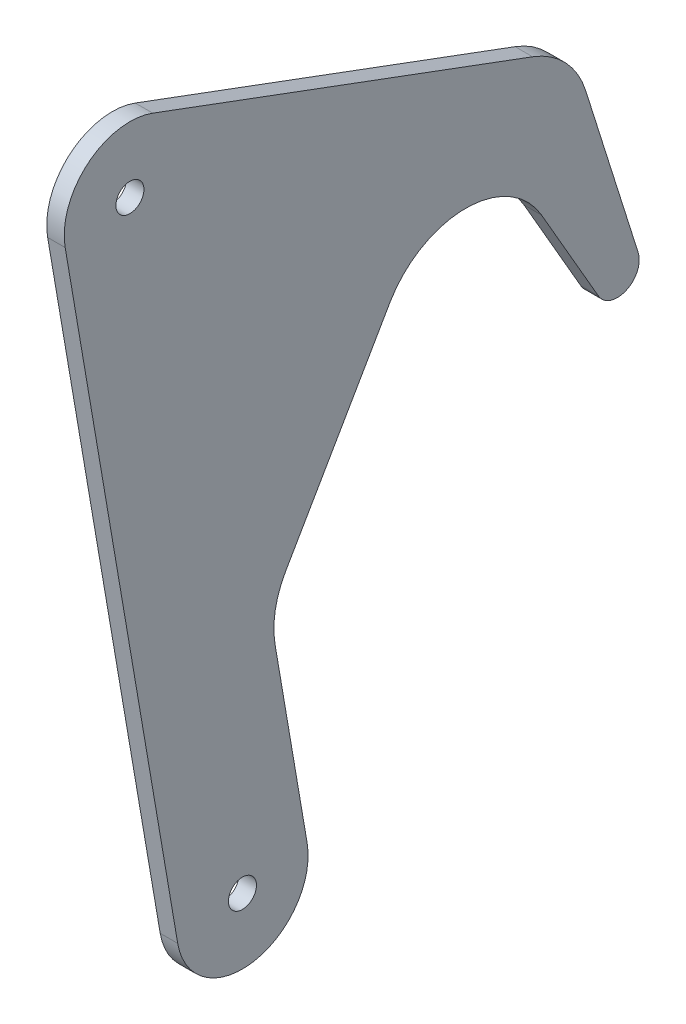
ISO-10303-21;
HEADER;
FILE_DESCRIPTION(('STEP AP214'),'2;1');
FILE_NAME('part.step','',(''),(''),'','','');
FILE_SCHEMA(('AUTOMOTIVE_DESIGN { 1 0 10303 214 1 1 1 1 }'));
ENDSEC;
DATA;
#1=APPLICATION_CONTEXT('core data for automotive mechanical design processes');
#2=APPLICATION_PROTOCOL_DEFINITION('international standard','automotive_design',2000,#1);
#3=PRODUCT_CONTEXT('',#1,'mechanical');
#4=PRODUCT('Part','Part','',(#3));
#5=PRODUCT_RELATED_PRODUCT_CATEGORY('part','',(#4));
#6=PRODUCT_DEFINITION_FORMATION('','',#4);
#7=PRODUCT_DEFINITION_CONTEXT('part definition',#1,'design');
#8=PRODUCT_DEFINITION('design','',#6,#7);
#9=PRODUCT_DEFINITION_SHAPE('','',#8);
#10=(LENGTH_UNIT() NAMED_UNIT(*) SI_UNIT(.MILLI.,.METRE.));
#11=(NAMED_UNIT(*) PLANE_ANGLE_UNIT() SI_UNIT($,.RADIAN.));
#12=(NAMED_UNIT(*) SI_UNIT($,.STERADIAN.) SOLID_ANGLE_UNIT());
#13=UNCERTAINTY_MEASURE_WITH_UNIT(LENGTH_MEASURE(1.E-05),#10,'distance_accuracy_value','');
#14=(GEOMETRIC_REPRESENTATION_CONTEXT(3) GLOBAL_UNCERTAINTY_ASSIGNED_CONTEXT((#13)) GLOBAL_UNIT_ASSIGNED_CONTEXT((#10,
#11,#12)) REPRESENTATION_CONTEXT('',''));
#15=CARTESIAN_POINT('',(0.,0.,0.));
#16=DIRECTION('',(0.,0.,1.));
#17=DIRECTION('',(1.,0.,0.));
#18=AXIS2_PLACEMENT_3D('',#15,#16,#17);
#19=CARTESIAN_POINT('',(2.54,95.5648840903117,16.3222272442672));
#20=DIRECTION('',(-1.,0.,0.));
#21=DIRECTION('',(0.,0.,1.));
#22=AXIS2_PLACEMENT_3D('',#19,#20,#21);
#23=CYLINDRICAL_SURFACE('',#22,9.52500000000001);
#24=CARTESIAN_POINT('',(0.,95.5648840903117,16.3222272442672));
#25=DIRECTION('',(1.,0.,0.));
#26=DIRECTION('',(0.,0.,-1.));
#27=AXIS2_PLACEMENT_3D('',#24,#25,#26);
#28=CIRCLE('',#27,9.52500000000001);
#29=CARTESIAN_POINT('',(0.,104.493706377936,13.0053375029534));
#30=VERTEX_POINT('',#29);
#31=CARTESIAN_POINT('',(0.,93.961261582819,25.7112644608014));
#32=VERTEX_POINT('',#31);
#33=EDGE_CURVE('E160',#30,#32,#28,.T.);
#34=ORIENTED_EDGE('',*,*,#33,.T.);
#35=DIRECTION('',(-1.,0.,0.));
#36=VECTOR('',#35,1.);
#37=CARTESIAN_POINT('',(2.54,93.961261582819,25.7112644608014));
#38=LINE('',#37,#36);
#39=CARTESIAN_POINT('',(2.54,93.961261582819,25.7112644608014));
#40=VERTEX_POINT('',#39);
#41=EDGE_CURVE('E139',#40,#32,#38,.T.);
#42=ORIENTED_EDGE('',*,*,#41,.F.);
#43=CARTESIAN_POINT('',(2.54,95.5648840903117,16.3222272442672));
#44=DIRECTION('',(1.,0.,0.));
#45=DIRECTION('',(0.,0.,-1.));
#46=AXIS2_PLACEMENT_3D('',#43,#44,#45);
#47=CIRCLE('',#46,9.52500000000001);
#48=CARTESIAN_POINT('',(2.54,104.493706377936,13.0053375029534));
#49=VERTEX_POINT('',#48);
#50=EDGE_CURVE('E147',#49,#40,#47,.T.);
#51=ORIENTED_EDGE('',*,*,#50,.F.);
#52=DIRECTION('',(-1.,0.,0.));
#53=VECTOR('',#52,1.);
#54=CARTESIAN_POINT('',(2.54,104.493706377936,13.0053375029534));
#55=LINE('',#54,#53);
#56=EDGE_CURVE('E189',#49,#30,#55,.T.);
#57=ORIENTED_EDGE('',*,*,#56,.T.);
#58=EDGE_LOOP('',(#34,#42,#51,#57));
#59=FACE_BOUND('',#58,.T.);
#60=ADVANCED_FACE('F44',(#59),#23,.T.);
#61=CARTESIAN_POINT('',(2.54,93.961261582819,25.7112644608014));
#62=DIRECTION('',(0.,0.168359318371934,-0.98572569202458));
#63=DIRECTION('',(0.,0.98572569202458,0.168359318371934));
#64=AXIS2_PLACEMENT_3D('',#61,#62,#63);
#65=PLANE('',#64);
#66=DIRECTION('',(0.,-0.98572569202458,-0.168359318371934));
#67=VECTOR('',#66,1.);
#68=CARTESIAN_POINT('',(0.,93.961261582819,25.7112644608014));
#69=LINE('',#68,#67);
#70=CARTESIAN_POINT('',(0.,-1.60362250749268,9.38903721653413));
#71=VERTEX_POINT('',#70);
#72=EDGE_CURVE('E208',#32,#71,#69,.T.);
#73=ORIENTED_EDGE('',*,*,#72,.T.);
#74=DIRECTION('',(-1.,0.,0.));
#75=VECTOR('',#74,1.);
#76=CARTESIAN_POINT('',(2.54,-1.60362250749268,9.38903721653413));
#77=LINE('',#76,#75);
#78=CARTESIAN_POINT('',(2.54,-1.60362250749268,9.38903721653413));
#79=VERTEX_POINT('',#78);
#80=EDGE_CURVE('E142',#79,#71,#77,.T.);
#81=ORIENTED_EDGE('',*,*,#80,.F.);
#82=DIRECTION('',(0.,-0.98572569202458,-0.168359318371934));
#83=VECTOR('',#82,1.);
#84=CARTESIAN_POINT('',(2.54,93.961261582819,25.7112644608014));
#85=LINE('',#84,#83);
#86=EDGE_CURVE('E135',#40,#79,#85,.T.);
#87=ORIENTED_EDGE('',*,*,#86,.F.);
#88=ORIENTED_EDGE('',*,*,#41,.T.);
#89=EDGE_LOOP('',(#73,#81,#87,#88));
#90=FACE_BOUND('',#89,.T.);
#91=ADVANCED_FACE('F137',(#90),#65,.F.);
#92=CARTESIAN_POINT('',(2.54,0.,0.));
#93=DIRECTION('',(-1.,0.,0.));
#94=DIRECTION('',(0.,0.,1.));
#95=AXIS2_PLACEMENT_3D('',#92,#93,#94);
#96=CYLINDRICAL_SURFACE('',#95,9.525);
#97=CARTESIAN_POINT('',(0.,0.,0.));
#98=DIRECTION('',(1.,0.,0.));
#99=DIRECTION('',(0.,0.,-1.));
#100=AXIS2_PLACEMENT_3D('',#97,#98,#99);
#101=CIRCLE('',#100,9.525);
#102=CARTESIAN_POINT('',(0.,1.60362250749268,-9.38903721653413));
#103=VERTEX_POINT('',#102);
#104=EDGE_CURVE('E206',#71,#103,#101,.T.);
#105=ORIENTED_EDGE('',*,*,#104,.T.);
#106=DIRECTION('',(-1.,0.,0.));
#107=VECTOR('',#106,1.);
#108=CARTESIAN_POINT('',(2.54,1.60362250749268,-9.38903721653413));
#109=LINE('',#108,#107);
#110=CARTESIAN_POINT('',(2.54,1.60362250749268,-9.38903721653413));
#111=VERTEX_POINT('',#110);
#112=EDGE_CURVE('E165',#111,#103,#109,.T.);
#113=ORIENTED_EDGE('',*,*,#112,.F.);
#114=CARTESIAN_POINT('',(2.54,0.,0.));
#115=DIRECTION('',(1.,0.,0.));
#116=DIRECTION('',(0.,0.,-1.));
#117=AXIS2_PLACEMENT_3D('',#114,#115,#116);
#118=CIRCLE('',#117,9.525);
#119=EDGE_CURVE('E146',#79,#111,#118,.T.);
#120=ORIENTED_EDGE('',*,*,#119,.F.);
#121=ORIENTED_EDGE('',*,*,#80,.T.);
#122=EDGE_LOOP('',(#105,#113,#120,#121));
#123=FACE_BOUND('',#122,.T.);
#124=ADVANCED_FACE('F270',(#123),#96,.T.);
#125=CARTESIAN_POINT('',(2.54,1.60362250749268,-9.38903721653413));
#126=DIRECTION('',(0.,-0.168359318371934,0.98572569202458));
#127=DIRECTION('',(0.,-0.98572569202458,-0.168359318371934));
#128=AXIS2_PLACEMENT_3D('',#125,#126,#127);
#129=PLANE('',#128);
#130=DIRECTION('',(0.,0.98572569202458,0.168359318371934));
#131=VECTOR('',#130,1.);
#132=CARTESIAN_POINT('',(0.,1.60362250749268,-9.38903721653413));
#133=LINE('',#132,#131);
#134=CARTESIAN_POINT('',(0.,28.8180866611722,-4.74087934478345));
#135=VERTEX_POINT('',#134);
#136=EDGE_CURVE('E204',#103,#135,#133,.T.);
#137=ORIENTED_EDGE('',*,*,#136,.T.);
#138=DIRECTION('',(-1.,0.,0.));
#139=VECTOR('',#138,1.);
#140=CARTESIAN_POINT('',(2.54,28.8180866611722,-4.74087934478345));
#141=LINE('',#140,#139);
#142=CARTESIAN_POINT('',(2.54,28.8180866611722,-4.74087934478345));
#143=VERTEX_POINT('',#142);
#144=EDGE_CURVE('E171',#143,#135,#141,.T.);
#145=ORIENTED_EDGE('',*,*,#144,.F.);
#146=DIRECTION('',(0.,0.98572569202458,0.168359318371934));
#147=VECTOR('',#146,1.);
#148=CARTESIAN_POINT('',(2.54,1.60362250749268,-9.38903721653413));
#149=LINE('',#148,#147);
#150=EDGE_CURVE('E232',#111,#143,#149,.T.);
#151=ORIENTED_EDGE('',*,*,#150,.F.);
#152=ORIENTED_EDGE('',*,*,#112,.T.);
#153=EDGE_LOOP('',(#137,#145,#151,#152));
#154=FACE_BOUND('',#153,.T.);
#155=ADVANCED_FACE('F278',(#154),#129,.F.);
#156=CARTESIAN_POINT('',(2.54,30.9562500044958,-17.2595956334956));
#157=DIRECTION('',(-1.,0.,0.));
#158=DIRECTION('',(0.,0.,1.));
#159=AXIS2_PLACEMENT_3D('',#156,#157,#158);
#160=CYLINDRICAL_SURFACE('',#159,12.7);
#161=CARTESIAN_POINT('',(0.,30.9562500044958,-17.2595956334956));
#162=DIRECTION('',(-1.,0.,0.));
#163=DIRECTION('',(0.,0.,-1.));
#164=AXIS2_PLACEMENT_3D('',#161,#162,#163);
#165=CIRCLE('',#164,12.7);
#166=CARTESIAN_POINT('',(0.,37.3062500044958,-6.26107300543326));
#167=VERTEX_POINT('',#166);
#168=EDGE_CURVE('E202',#135,#167,#165,.T.);
#169=ORIENTED_EDGE('',*,*,#168,.T.);
#170=DIRECTION('',(-1.,0.,0.));
#171=VECTOR('',#170,1.);
#172=CARTESIAN_POINT('',(2.54,37.3062500044958,-6.26107300543326));
#173=LINE('',#172,#171);
#174=CARTESIAN_POINT('',(2.54,37.3062500044958,-6.26107300543326));
#175=VERTEX_POINT('',#174);
#176=EDGE_CURVE('E174',#175,#167,#173,.T.);
#177=ORIENTED_EDGE('',*,*,#176,.F.);
#178=CARTESIAN_POINT('',(2.54,30.9562500044958,-17.2595956334956));
#179=DIRECTION('',(-1.,0.,0.));
#180=DIRECTION('',(0.,0.,-1.));
#181=AXIS2_PLACEMENT_3D('',#178,#179,#180);
#182=CIRCLE('',#181,12.7);
#183=EDGE_CURVE('E240',#143,#175,#182,.T.);
#184=ORIENTED_EDGE('',*,*,#183,.F.);
#185=ORIENTED_EDGE('',*,*,#144,.T.);
#186=EDGE_LOOP('',(#169,#177,#184,#185));
#187=FACE_BOUND('',#186,.T.);
#188=ADVANCED_FACE('F281',(#187),#160,.F.);
#189=CARTESIAN_POINT('',(2.54,37.3062500044958,-6.26107300543326));
#190=DIRECTION('',(0.,0.500000000000001,0.866025403784438));
#191=DIRECTION('',(0.,-0.866025403784438,0.500000000000001));
#192=AXIS2_PLACEMENT_3D('',#189,#190,#191);
#193=PLANE('',#192);
#194=DIRECTION('',(0.,0.866025403784438,-0.500000000000001));
#195=VECTOR('',#194,1.);
#196=CARTESIAN_POINT('',(0.,37.3062500044958,-6.26107300543326));
#197=LINE('',#196,#195);
#198=CARTESIAN_POINT('',(0.,63.5000000000171,-21.3840416164333));
#199=VERTEX_POINT('',#198);
#200=EDGE_CURVE('E200',#167,#199,#197,.T.);
#201=ORIENTED_EDGE('',*,*,#200,.T.);
#202=DIRECTION('',(-1.,0.,0.));
#203=VECTOR('',#202,1.);
#204=CARTESIAN_POINT('',(2.54,63.5000000000171,-21.3840416164333));
#205=LINE('',#204,#203);
#206=CARTESIAN_POINT('',(2.54,63.5000000000171,-21.3840416164333));
#207=VERTEX_POINT('',#206);
#208=EDGE_CURVE('E177',#207,#199,#205,.T.);
#209=ORIENTED_EDGE('',*,*,#208,.F.);
#210=DIRECTION('',(0.,0.866025403784438,-0.500000000000001));
#211=VECTOR('',#210,1.);
#212=CARTESIAN_POINT('',(2.54,37.3062500044958,-6.26107300543326));
#213=LINE('',#212,#211);
#214=EDGE_CURVE('E243',#175,#207,#213,.T.);
#215=ORIENTED_EDGE('',*,*,#214,.F.);
#216=ORIENTED_EDGE('',*,*,#176,.T.);
#217=EDGE_LOOP('',(#201,#209,#215,#216));
#218=FACE_BOUND('',#217,.T.);
#219=ADVANCED_FACE('F286',(#218),#193,.F.);
#220=CARTESIAN_POINT('',(2.54,57.1500000000171,-32.3825642444956));
#221=DIRECTION('',(-1.,0.,0.));
#222=DIRECTION('',(0.,0.,1.));
#223=AXIS2_PLACEMENT_3D('',#220,#221,#222);
#224=CYLINDRICAL_SURFACE('',#223,12.7);
#225=CARTESIAN_POINT('',(0.,57.1500000000171,-32.3825642444956));
#226=DIRECTION('',(-1.,0.,0.));
#227=DIRECTION('',(0.,0.,-1.));
#228=AXIS2_PLACEMENT_3D('',#225,#226,#227);
#229=CIRCLE('',#228,12.7);
#230=CARTESIAN_POINT('',(0.,63.5000000000171,-43.381086872558));
#231=VERTEX_POINT('',#230);
#232=EDGE_CURVE('E198',#199,#231,#229,.T.);
#233=ORIENTED_EDGE('',*,*,#232,.T.);
#234=DIRECTION('',(-1.,0.,0.));
#235=VECTOR('',#234,1.);
#236=CARTESIAN_POINT('',(2.54,63.5000000000171,-43.381086872558));
#237=LINE('',#236,#235);
#238=CARTESIAN_POINT('',(2.54,63.5000000000171,-43.381086872558));
#239=VERTEX_POINT('',#238);
#240=EDGE_CURVE('E180',#239,#231,#237,.T.);
#241=ORIENTED_EDGE('',*,*,#240,.F.);
#242=CARTESIAN_POINT('',(2.54,57.1500000000171,-32.3825642444956));
#243=DIRECTION('',(-1.,0.,0.));
#244=DIRECTION('',(0.,0.,-1.));
#245=AXIS2_PLACEMENT_3D('',#242,#243,#244);
#246=CIRCLE('',#245,12.7);
#247=EDGE_CURVE('E247',#207,#239,#246,.T.);
#248=ORIENTED_EDGE('',*,*,#247,.F.);
#249=ORIENTED_EDGE('',*,*,#208,.T.);
#250=EDGE_LOOP('',(#233,#241,#248,#249));
#251=FACE_BOUND('',#250,.T.);
#252=ADVANCED_FACE('F292',(#251),#224,.F.);
#253=CARTESIAN_POINT('',(2.54,49.2125000000171,-51.6299788436048));
#254=DIRECTION('',(0.,0.500000000000001,-0.866025403784438));
#255=DIRECTION('',(0.,0.866025403784438,0.500000000000001));
#256=AXIS2_PLACEMENT_3D('',#253,#254,#255);
#257=PLANE('',#256);
#258=DIRECTION('',(0.,-0.866025403784438,-0.500000000000001));
#259=VECTOR('',#258,1.);
#260=CARTESIAN_POINT('',(0.,49.2125000000171,-51.6299788436048));
#261=LINE('',#260,#259);
#262=CARTESIAN_POINT('',(0.,49.2125000000171,-51.6299788436048));
#263=VERTEX_POINT('',#262);
#264=EDGE_CURVE('E196',#231,#263,#261,.T.);
#265=ORIENTED_EDGE('',*,*,#264,.T.);
#266=DIRECTION('',(-1.,0.,0.));
#267=VECTOR('',#266,1.);
#268=CARTESIAN_POINT('',(2.54,49.2125000000171,-51.6299788436048));
#269=LINE('',#268,#267);
#270=CARTESIAN_POINT('',(2.54,49.2125000000171,-51.6299788436048));
#271=VERTEX_POINT('',#270);
#272=EDGE_CURVE('E183',#271,#263,#269,.T.);
#273=ORIENTED_EDGE('',*,*,#272,.F.);
#274=DIRECTION('',(0.,-0.866025403784438,-0.500000000000001));
#275=VECTOR('',#274,1.);
#276=CARTESIAN_POINT('',(2.54,49.2125000000171,-51.6299788436048));
#277=LINE('',#276,#275);
#278=EDGE_CURVE('E251',#239,#271,#277,.T.);
#279=ORIENTED_EDGE('',*,*,#278,.F.);
#280=ORIENTED_EDGE('',*,*,#240,.T.);
#281=EDGE_LOOP('',(#265,#273,#279,#280));
#282=FACE_BOUND('',#281,.T.);
#283=ADVANCED_FACE('F296',(#282),#257,.F.);
#284=CARTESIAN_POINT('',(2.54,50.8000000000171,-54.3796095006204));
#285=DIRECTION('',(-1.,0.,0.));
#286=DIRECTION('',(0.,0.,1.));
#287=AXIS2_PLACEMENT_3D('',#284,#285,#286);
#288=CYLINDRICAL_SURFACE('',#287,3.17500000000001);
#289=CARTESIAN_POINT('',(0.,50.8000000000171,-54.3796095006204));
#290=DIRECTION('',(1.,0.,0.));
#291=DIRECTION('',(0.,0.,1.));
#292=AXIS2_PLACEMENT_3D('',#289,#290,#291);
#293=CIRCLE('',#292,3.17500000000001);
#294=CARTESIAN_POINT('',(0.,51.7547409134432,-57.407660819246));
#295=VERTEX_POINT('',#294);
#296=EDGE_CURVE('E194',#263,#295,#293,.T.);
#297=ORIENTED_EDGE('',*,*,#296,.T.);
#298=DIRECTION('',(-1.,0.,0.));
#299=VECTOR('',#298,1.);
#300=CARTESIAN_POINT('',(2.54,51.7547409134432,-57.407660819246));
#301=LINE('',#300,#299);
#302=CARTESIAN_POINT('',(2.54,51.7547409134432,-57.407660819246));
#303=VERTEX_POINT('',#302);
#304=EDGE_CURVE('E186',#303,#295,#301,.T.);
#305=ORIENTED_EDGE('',*,*,#304,.F.);
#306=CARTESIAN_POINT('',(2.54,50.8000000000171,-54.3796095006204));
#307=DIRECTION('',(1.,0.,0.));
#308=DIRECTION('',(0.,0.,1.));
#309=AXIS2_PLACEMENT_3D('',#306,#307,#308);
#310=CIRCLE('',#309,3.17500000000001);
#311=EDGE_CURVE('E254',#271,#303,#310,.T.);
#312=ORIENTED_EDGE('',*,*,#311,.F.);
#313=ORIENTED_EDGE('',*,*,#272,.T.);
#314=EDGE_LOOP('',(#297,#305,#312,#313));
#315=FACE_BOUND('',#314,.T.);
#316=ADVANCED_FACE('F299',(#315),#288,.T.);
#317=CARTESIAN_POINT('',(2.54,81.8631220128201,-47.9145247235053));
#318=DIRECTION('',(0.,-0.300705799504282,0.953716950748224));
#319=DIRECTION('',(0.,-0.953716950748224,-0.300705799504282));
#320=AXIS2_PLACEMENT_3D('',#317,#318,#319);
#321=PLANE('',#320);
#322=DIRECTION('',(0.,0.953716950748224,0.300705799504282));
#323=VECTOR('',#322,1.);
#324=CARTESIAN_POINT('',(0.,81.8631220128201,-47.9145247235053));
#325=LINE('',#324,#323);
#326=CARTESIAN_POINT('',(0.,75.9397758478724,-49.7821485954243));
#327=VERTEX_POINT('',#326);
#328=EDGE_CURVE('E192',#295,#327,#325,.T.);
#329=ORIENTED_EDGE('',*,*,#328,.T.);
#330=DIRECTION('',(-1.,0.,0.));
#331=VECTOR('',#330,1.);
#332=CARTESIAN_POINT('',(2.54,75.9397758478724,-49.7821485954243));
#333=LINE('',#332,#331);
#334=CARTESIAN_POINT('',(2.54,75.9397758478724,-49.7821485954243));
#335=VERTEX_POINT('',#334);
#336=EDGE_CURVE('E54',#327,#335,#333,.F.);
#337=ORIENTED_EDGE('',*,*,#336,.T.);
#338=DIRECTION('',(0.,0.953716950748224,0.300705799504282));
#339=VECTOR('',#338,1.);
#340=CARTESIAN_POINT('',(2.54,81.8631220128201,-47.9145247235053));
#341=LINE('',#340,#339);
#342=EDGE_CURVE('E215',#303,#335,#341,.T.);
#343=ORIENTED_EDGE('',*,*,#342,.F.);
#344=ORIENTED_EDGE('',*,*,#304,.T.);
#345=EDGE_LOOP('',(#329,#337,#343,#344));
#346=FACE_BOUND('',#345,.T.);
#347=ADVANCED_FACE('F300',(#346),#321,.F.);
#348=CARTESIAN_POINT('',(2.54,104.493706377936,13.0053375029534));
#349=DIRECTION('',(0.,-0.93740916405499,0.348229894101189));
#350=DIRECTION('',(0.,-0.348229894101189,-0.93740916405499));
#351=AXIS2_PLACEMENT_3D('',#348,#349,#350);
#352=PLANE('',#351);
#353=DIRECTION('',(0.,0.348229894101189,0.93740916405499));
#354=VECTOR('',#353,1.);
#355=CARTESIAN_POINT('',(2.54,104.493706377936,13.0053375029534));
#356=LINE('',#355,#354);
#357=CARTESIAN_POINT('',(2.54,84.0259085776664,-42.092462976007));
#358=VERTEX_POINT('',#357);
#359=EDGE_CURVE('E152',#358,#49,#356,.T.);
#360=ORIENTED_EDGE('',*,*,#359,.F.);
#361=DIRECTION('',(-1.,0.,0.));
#362=VECTOR('',#361,1.);
#363=CARTESIAN_POINT('',(2.54,84.0259085776664,-42.092462976007));
#364=LINE('',#363,#362);
#365=CARTESIAN_POINT('',(0.,84.0259085776664,-42.092462976007));
#366=VERTEX_POINT('',#365);
#367=EDGE_CURVE('E161',#358,#366,#364,.T.);
#368=ORIENTED_EDGE('',*,*,#367,.T.);
#369=DIRECTION('',(0.,0.348229894101189,0.93740916405499));
#370=VECTOR('',#369,1.);
#371=CARTESIAN_POINT('',(0.,104.493706377936,13.0053375029534));
#372=LINE('',#371,#370);
#373=EDGE_CURVE('E157',#366,#30,#372,.T.);
#374=ORIENTED_EDGE('',*,*,#373,.T.);
#375=ORIENTED_EDGE('',*,*,#56,.F.);
#376=EDGE_LOOP('',(#360,#368,#374,#375));
#377=FACE_BOUND('',#376,.T.);
#378=ADVANCED_FACE('F265',(#377),#352,.F.);
#379=CARTESIAN_POINT('',(2.54,95.5648840903117,16.3222272442672));
#380=DIRECTION('',(1.,0.,0.));
#381=DIRECTION('',(0.,0.,-1.));
#382=AXIS2_PLACEMENT_3D('',#379,#380,#381);
#383=PLANE('',#382);
#384=CARTESIAN_POINT('',(2.54,0.,0.));
#385=DIRECTION('',(1.,0.,0.));
#386=DIRECTION('',(0.,0.,-1.));
#387=AXIS2_PLACEMENT_3D('',#384,#385,#386);
#388=CIRCLE('',#387,2.032);
#389=CARTESIAN_POINT('',(2.54,0.,-2.032));
#390=VERTEX_POINT('',#389);
#391=EDGE_CURVE('E436',#390,#390,#388,.T.);
#392=ORIENTED_EDGE('',*,*,#391,.F.);
#393=EDGE_LOOP('',(#392));
#394=FACE_BOUND('',#393,.T.);
#395=CARTESIAN_POINT('',(2.54,95.5648840903117,16.3222272442672));
#396=DIRECTION('',(1.,0.,0.));
#397=DIRECTION('',(0.,0.,-1.));
#398=AXIS2_PLACEMENT_3D('',#395,#396,#397);
#399=CIRCLE('',#398,2.032);
#400=CARTESIAN_POINT('',(2.54,95.5648840903117,14.2902272442672));
#401=VERTEX_POINT('',#400);
#402=EDGE_CURVE('E439',#401,#401,#399,.T.);
#403=ORIENTED_EDGE('',*,*,#402,.F.);
#404=EDGE_LOOP('',(#403));
#405=FACE_BOUND('',#404,.T.);
#406=ORIENTED_EDGE('',*,*,#342,.T.);
#407=CARTESIAN_POINT('',(2.54,72.120812194168,-37.6699433209219));
#408=DIRECTION('',(1.,0.,0.));
#409=DIRECTION('',(0.,0.,-1.));
#410=AXIS2_PLACEMENT_3D('',#407,#408,#409);
#411=CIRCLE('',#410,12.7);
#412=EDGE_CURVE('E12',#335,#358,#411,.T.);
#413=ORIENTED_EDGE('',*,*,#412,.T.);
#414=ORIENTED_EDGE('',*,*,#359,.T.);
#415=ORIENTED_EDGE('',*,*,#50,.T.);
#416=ORIENTED_EDGE('',*,*,#86,.T.);
#417=ORIENTED_EDGE('',*,*,#119,.T.);
#418=ORIENTED_EDGE('',*,*,#150,.T.);
#419=ORIENTED_EDGE('',*,*,#183,.T.);
#420=ORIENTED_EDGE('',*,*,#214,.T.);
#421=ORIENTED_EDGE('',*,*,#247,.T.);
#422=ORIENTED_EDGE('',*,*,#278,.T.);
#423=ORIENTED_EDGE('',*,*,#311,.T.);
#424=EDGE_LOOP('',(#406,#413,#414,#415,#416,#417,#418,#419,#420,#421,#422,#423));
#425=FACE_BOUND('',#424,.T.);
#426=ADVANCED_FACE('F150',(#394,#405,#425),#383,.T.);
#427=CARTESIAN_POINT('',(0.,95.5648840903117,16.3222272442672));
#428=DIRECTION('',(1.,0.,0.));
#429=DIRECTION('',(0.,0.,-1.));
#430=AXIS2_PLACEMENT_3D('',#427,#428,#429);
#431=PLANE('',#430);
#432=CARTESIAN_POINT('',(0.,0.,0.));
#433=DIRECTION('',(1.,0.,0.));
#434=DIRECTION('',(0.,0.,-1.));
#435=AXIS2_PLACEMENT_3D('',#432,#433,#434);
#436=CIRCLE('',#435,2.032);
#437=CARTESIAN_POINT('',(0.,0.,-2.032));
#438=VERTEX_POINT('',#437);
#439=EDGE_CURVE('E211',#438,#438,#436,.T.);
#440=ORIENTED_EDGE('',*,*,#439,.T.);
#441=EDGE_LOOP('',(#440));
#442=FACE_BOUND('',#441,.T.);
#443=CARTESIAN_POINT('',(0.,95.5648840903117,16.3222272442672));
#444=DIRECTION('',(1.,0.,0.));
#445=DIRECTION('',(0.,0.,-1.));
#446=AXIS2_PLACEMENT_3D('',#443,#444,#445);
#447=CIRCLE('',#446,2.032);
#448=CARTESIAN_POINT('',(0.,95.5648840903117,14.2902272442672));
#449=VERTEX_POINT('',#448);
#450=EDGE_CURVE('E225',#449,#449,#447,.T.);
#451=ORIENTED_EDGE('',*,*,#450,.T.);
#452=EDGE_LOOP('',(#451));
#453=FACE_BOUND('',#452,.T.);
#454=ORIENTED_EDGE('',*,*,#373,.F.);
#455=CARTESIAN_POINT('',(0.,72.120812194168,-37.6699433209219));
#456=DIRECTION('',(1.,0.,0.));
#457=DIRECTION('',(0.,0.,-1.));
#458=AXIS2_PLACEMENT_3D('',#455,#456,#457);
#459=CIRCLE('',#458,12.7);
#460=EDGE_CURVE('E68',#366,#327,#459,.F.);
#461=ORIENTED_EDGE('',*,*,#460,.T.);
#462=ORIENTED_EDGE('',*,*,#328,.F.);
#463=ORIENTED_EDGE('',*,*,#296,.F.);
#464=ORIENTED_EDGE('',*,*,#264,.F.);
#465=ORIENTED_EDGE('',*,*,#232,.F.);
#466=ORIENTED_EDGE('',*,*,#200,.F.);
#467=ORIENTED_EDGE('',*,*,#168,.F.);
#468=ORIENTED_EDGE('',*,*,#136,.F.);
#469=ORIENTED_EDGE('',*,*,#104,.F.);
#470=ORIENTED_EDGE('',*,*,#72,.F.);
#471=ORIENTED_EDGE('',*,*,#33,.F.);
#472=EDGE_LOOP('',(#454,#461,#462,#463,#464,#465,#466,#467,#468,#469,#470,#471));
#473=FACE_BOUND('',#472,.T.);
#474=ADVANCED_FACE('F266',(#442,#453,#473),#431,.F.);
#475=CARTESIAN_POINT('',(0.,95.5648840903117,16.3222272442672));
#476=DIRECTION('',(1.,0.,0.));
#477=DIRECTION('',(0.,0.,-1.));
#478=AXIS2_PLACEMENT_3D('',#475,#476,#477);
#479=CYLINDRICAL_SURFACE('',#478,2.032);
#480=ORIENTED_EDGE('',*,*,#450,.F.);
#481=EDGE_LOOP('',(#480));
#482=FACE_BOUND('',#481,.T.);
#483=ORIENTED_EDGE('',*,*,#402,.T.);
#484=EDGE_LOOP('',(#483));
#485=FACE_BOUND('',#484,.T.);
#486=ADVANCED_FACE('F340',(#482,#485),#479,.F.);
#487=CARTESIAN_POINT('',(0.,0.,0.));
#488=DIRECTION('',(1.,0.,0.));
#489=DIRECTION('',(0.,0.,-1.));
#490=AXIS2_PLACEMENT_3D('',#487,#488,#489);
#491=CYLINDRICAL_SURFACE('',#490,2.032);
#492=ORIENTED_EDGE('',*,*,#439,.F.);
#493=EDGE_LOOP('',(#492));
#494=FACE_BOUND('',#493,.T.);
#495=ORIENTED_EDGE('',*,*,#391,.T.);
#496=EDGE_LOOP('',(#495));
#497=FACE_BOUND('',#496,.T.);
#498=ADVANCED_FACE('F343',(#494,#497),#491,.F.);
#499=CARTESIAN_POINT('',(2.54,72.120812194168,-37.6699433209219));
#500=DIRECTION('',(-1.,0.,0.));
#501=DIRECTION('',(0.,0.,1.));
#502=AXIS2_PLACEMENT_3D('',#499,#500,#501);
#503=CYLINDRICAL_SURFACE('',#502,12.7);
#504=ORIENTED_EDGE('',*,*,#412,.F.);
#505=ORIENTED_EDGE('',*,*,#336,.F.);
#506=ORIENTED_EDGE('',*,*,#460,.F.);
#507=ORIENTED_EDGE('',*,*,#367,.F.);
#508=EDGE_LOOP('',(#504,#505,#506,#507));
#509=FACE_BOUND('',#508,.T.);
#510=ADVANCED_FACE('F46',(#509),#503,.T.);
#511=CLOSED_SHELL('',(#60,#91,#124,#155,#188,#219,#252,#283,#316,#347,#378,#426,#474,#486,#498,#510));
#512=MANIFOLD_SOLID_BREP('B2',#511);
#513=ADVANCED_BREP_SHAPE_REPRESENTATION('',(#18,#512),#14);
#514=SHAPE_DEFINITION_REPRESENTATION(#9,#513);
ENDSEC;
END-ISO-10303-21;
